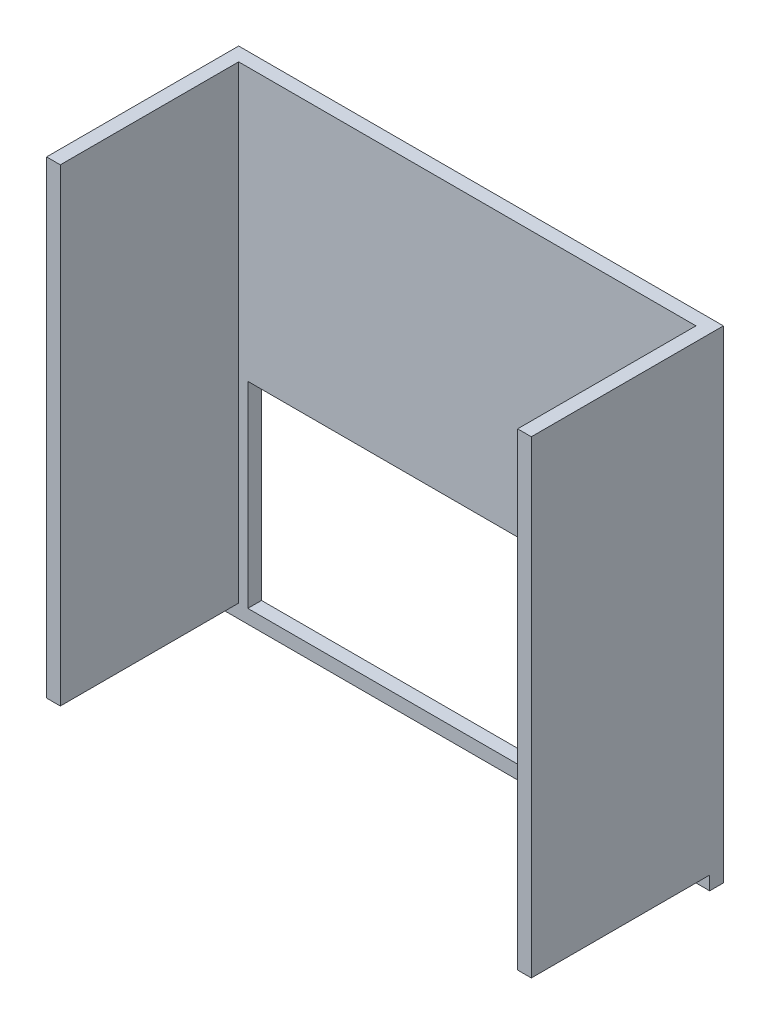
ISO-10303-21;
HEADER;
FILE_DESCRIPTION(('STEP AP214'),'2;1');
FILE_NAME('part.step','',(''),(''),'','','');
FILE_SCHEMA(('AUTOMOTIVE_DESIGN { 1 0 10303 214 1 1 1 1 }'));
ENDSEC;
DATA;
#1=APPLICATION_CONTEXT('core data for automotive mechanical design processes');
#2=APPLICATION_PROTOCOL_DEFINITION('international standard','automotive_design',2000,#1);
#3=PRODUCT_CONTEXT('',#1,'mechanical');
#4=PRODUCT('Part','Part','',(#3));
#5=PRODUCT_RELATED_PRODUCT_CATEGORY('part','',(#4));
#6=PRODUCT_DEFINITION_FORMATION('','',#4);
#7=PRODUCT_DEFINITION_CONTEXT('part definition',#1,'design');
#8=PRODUCT_DEFINITION('design','',#6,#7);
#9=PRODUCT_DEFINITION_SHAPE('','',#8);
#10=(LENGTH_UNIT() NAMED_UNIT(*) SI_UNIT(.MILLI.,.METRE.));
#11=(NAMED_UNIT(*) PLANE_ANGLE_UNIT() SI_UNIT($,.RADIAN.));
#12=(NAMED_UNIT(*) SI_UNIT($,.STERADIAN.) SOLID_ANGLE_UNIT());
#13=UNCERTAINTY_MEASURE_WITH_UNIT(LENGTH_MEASURE(1.E-05),#10,'distance_accuracy_value','');
#14=(GEOMETRIC_REPRESENTATION_CONTEXT(3) GLOBAL_UNCERTAINTY_ASSIGNED_CONTEXT((#13)) GLOBAL_UNIT_ASSIGNED_CONTEXT((#10,
#11,#12)) REPRESENTATION_CONTEXT('',''));
#15=CARTESIAN_POINT('',(0.,0.,0.));
#16=DIRECTION('',(0.,0.,1.));
#17=DIRECTION('',(1.,0.,0.));
#18=AXIS2_PLACEMENT_3D('',#15,#16,#17);
#19=CARTESIAN_POINT('',(0.,0.,0.25));
#20=DIRECTION('',(0.,0.,-1.));
#21=DIRECTION('',(-1.,0.,0.));
#22=AXIS2_PLACEMENT_3D('',#19,#20,#21);
#23=PLANE('',#22);
#24=DIRECTION('',(0.,1.,0.));
#25=VECTOR('',#24,1.);
#26=CARTESIAN_POINT('',(-53.,105.5,0.25));
#27=LINE('',#26,#25);
#28=CARTESIAN_POINT('',(-53.,3.,0.25));
#29=VERTEX_POINT('',#28);
#30=CARTESIAN_POINT('',(-53.,105.5,0.25));
#31=VERTEX_POINT('',#30);
#32=EDGE_CURVE('E217',#29,#31,#27,.T.);
#33=ORIENTED_EDGE('',*,*,#32,.F.);
#34=DIRECTION('',(1.,0.,0.));
#35=VECTOR('',#34,1.);
#36=CARTESIAN_POINT('',(0.,3.,0.25));
#37=LINE('',#36,#35);
#38=CARTESIAN_POINT('',(-50.,3.,0.25));
#39=VERTEX_POINT('',#38);
#40=EDGE_CURVE('E11',#29,#39,#37,.T.);
#41=ORIENTED_EDGE('',*,*,#40,.T.);
#42=DIRECTION('',(0.,-1.,0.));
#43=VECTOR('',#42,1.);
#44=CARTESIAN_POINT('',(-50.,0.,0.25));
#45=LINE('',#44,#43);
#46=CARTESIAN_POINT('',(-50.,105.5,0.25));
#47=VERTEX_POINT('',#46);
#48=EDGE_CURVE('E225',#47,#39,#45,.T.);
#49=ORIENTED_EDGE('',*,*,#48,.F.);
#50=DIRECTION('',(1.,0.,0.));
#51=VECTOR('',#50,1.);
#52=CARTESIAN_POINT('',(53.,105.5,0.25));
#53=LINE('',#52,#51);
#54=EDGE_CURVE('E216',#31,#47,#53,.T.);
#55=ORIENTED_EDGE('',*,*,#54,.F.);
#56=EDGE_LOOP('',(#33,#41,#49,#55));
#57=FACE_BOUND('',#56,.T.);
#58=ADVANCED_FACE('F41',(#57),#23,.F.);
#59=CARTESIAN_POINT('',(0.,3.,0.));
#60=DIRECTION('',(0.,-1.,0.));
#61=DIRECTION('',(0.,0.,-1.));
#62=AXIS2_PLACEMENT_3D('',#59,#60,#61);
#63=PLANE('',#62);
#64=DIRECTION('',(0.,0.,-1.));
#65=VECTOR('',#64,1.);
#66=CARTESIAN_POINT('',(-48.,3.,0.251000000000015));
#67=LINE('',#66,#65);
#68=CARTESIAN_POINT('',(-48.,3.,-38.75));
#69=VERTEX_POINT('',#68);
#70=CARTESIAN_POINT('',(-48.,3.,-41.75));
#71=VERTEX_POINT('',#70);
#72=EDGE_CURVE('E268',#69,#71,#67,.T.);
#73=ORIENTED_EDGE('',*,*,#72,.F.);
#74=DIRECTION('',(-1.,0.,0.));
#75=VECTOR('',#74,1.);
#76=CARTESIAN_POINT('',(-53.,3.,-38.75));
#77=LINE('',#76,#75);
#78=CARTESIAN_POINT('',(48.,3.,-38.75));
#79=VERTEX_POINT('',#78);
#80=EDGE_CURVE('E190',#79,#69,#77,.T.);
#81=ORIENTED_EDGE('',*,*,#80,.F.);
#82=DIRECTION('',(0.,0.,-1.));
#83=VECTOR('',#82,1.);
#84=CARTESIAN_POINT('',(48.,2.99999999999999,0.251000000000015));
#85=LINE('',#84,#83);
#86=CARTESIAN_POINT('',(48.,2.99999999999999,-41.75));
#87=VERTEX_POINT('',#86);
#88=EDGE_CURVE('E271',#79,#87,#85,.T.);
#89=ORIENTED_EDGE('',*,*,#88,.T.);
#90=DIRECTION('',(-1.,0.,0.));
#91=VECTOR('',#90,1.);
#92=CARTESIAN_POINT('',(-48.,3.,-41.75));
#93=LINE('',#92,#91);
#94=EDGE_CURVE('E264',#87,#71,#93,.T.);
#95=ORIENTED_EDGE('',*,*,#94,.T.);
#96=EDGE_LOOP('',(#73,#81,#89,#95));
#97=FACE_BOUND('',#96,.T.);
#98=ADVANCED_FACE('F293',(#97),#63,.F.);
#99=CARTESIAN_POINT('',(-50.,0.,38.75));
#100=DIRECTION('',(-1.,0.,0.));
#101=DIRECTION('',(0.,0.,1.));
#102=AXIS2_PLACEMENT_3D('',#99,#100,#101);
#103=PLANE('',#102);
#104=DIRECTION('',(0.,0.,1.));
#105=VECTOR('',#104,1.);
#106=CARTESIAN_POINT('',(-50.,105.5,38.75));
#107=LINE('',#106,#105);
#108=CARTESIAN_POINT('',(-50.,105.5,-38.75));
#109=VERTEX_POINT('',#108);
#110=EDGE_CURVE('E228',#109,#47,#107,.T.);
#111=ORIENTED_EDGE('',*,*,#110,.T.);
#112=ORIENTED_EDGE('',*,*,#48,.T.);
#113=DIRECTION('',(0.,0.,-1.));
#114=VECTOR('',#113,1.);
#115=CARTESIAN_POINT('',(-50.,3.,38.75));
#116=LINE('',#115,#114);
#117=CARTESIAN_POINT('',(-50.,3.,-38.75));
#118=VERTEX_POINT('',#117);
#119=EDGE_CURVE('E175',#39,#118,#116,.T.);
#120=ORIENTED_EDGE('',*,*,#119,.T.);
#121=DIRECTION('',(0.,1.,0.));
#122=VECTOR('',#121,1.);
#123=CARTESIAN_POINT('',(-50.,0.,-38.75));
#124=LINE('',#123,#122);
#125=EDGE_CURVE('E196',#118,#109,#124,.T.);
#126=ORIENTED_EDGE('',*,*,#125,.T.);
#127=EDGE_LOOP('',(#111,#112,#120,#126));
#128=FACE_BOUND('',#127,.T.);
#129=ADVANCED_FACE('F244',(#128),#103,.F.);
#130=CARTESIAN_POINT('',(-50.,0.,-38.75));
#131=DIRECTION('',(0.,0.,-1.));
#132=DIRECTION('',(-1.,0.,0.));
#133=AXIS2_PLACEMENT_3D('',#130,#131,#132);
#134=PLANE('',#133);
#135=ORIENTED_EDGE('',*,*,#80,.T.);
#136=DIRECTION('',(0.,-1.,0.));
#137=VECTOR('',#136,1.);
#138=CARTESIAN_POINT('',(-48.,3.,-38.75));
#139=LINE('',#138,#137);
#140=CARTESIAN_POINT('',(-48.,46.,-38.75));
#141=VERTEX_POINT('',#140);
#142=EDGE_CURVE('E249',#141,#69,#139,.T.);
#143=ORIENTED_EDGE('',*,*,#142,.F.);
#144=DIRECTION('',(-1.,0.,0.));
#145=VECTOR('',#144,1.);
#146=CARTESIAN_POINT('',(-48.,46.,-38.75));
#147=LINE('',#146,#145);
#148=CARTESIAN_POINT('',(48.,46.,-38.75));
#149=VERTEX_POINT('',#148);
#150=EDGE_CURVE('E270',#149,#141,#147,.T.);
#151=ORIENTED_EDGE('',*,*,#150,.F.);
#152=DIRECTION('',(0.,1.,0.));
#153=VECTOR('',#152,1.);
#154=CARTESIAN_POINT('',(48.,2.99999999999999,-38.75));
#155=LINE('',#154,#153);
#156=EDGE_CURVE('E64',#79,#149,#155,.T.);
#157=ORIENTED_EDGE('',*,*,#156,.F.);
#158=EDGE_LOOP('',(#135,#143,#151,#157));
#159=FACE_BOUND('',#158,.T.);
#160=ORIENTED_EDGE('',*,*,#125,.F.);
#161=CARTESIAN_POINT('',(-53.,3.,-38.75));
#162=VERTEX_POINT('',#161);
#163=EDGE_CURVE('E192',#118,#162,#77,.T.);
#164=ORIENTED_EDGE('',*,*,#163,.T.);
#165=DIRECTION('',(0.,-1.,0.));
#166=VECTOR('',#165,1.);
#167=CARTESIAN_POINT('',(-53.,3.,-38.75));
#168=LINE('',#167,#166);
#169=CARTESIAN_POINT('',(-53.,0.,-38.75));
#170=VERTEX_POINT('',#169);
#171=EDGE_CURVE('E150',#162,#170,#168,.T.);
#172=ORIENTED_EDGE('',*,*,#171,.T.);
#173=DIRECTION('',(1.,0.,0.));
#174=VECTOR('',#173,1.);
#175=CARTESIAN_POINT('',(-53.,0.,-38.75));
#176=LINE('',#175,#174);
#177=CARTESIAN_POINT('',(53.,0.,-38.75));
#178=VERTEX_POINT('',#177);
#179=EDGE_CURVE('E143',#170,#178,#176,.T.);
#180=ORIENTED_EDGE('',*,*,#179,.T.);
#181=DIRECTION('',(0.,1.,0.));
#182=VECTOR('',#181,1.);
#183=CARTESIAN_POINT('',(53.,3.,-38.75));
#184=LINE('',#183,#182);
#185=CARTESIAN_POINT('',(53.,3.,-38.75));
#186=VERTEX_POINT('',#185);
#187=EDGE_CURVE('E148',#178,#186,#184,.T.);
#188=ORIENTED_EDGE('',*,*,#187,.T.);
#189=CARTESIAN_POINT('',(50.,3.,-38.75));
#190=VERTEX_POINT('',#189);
#191=EDGE_CURVE('E180',#186,#190,#77,.T.);
#192=ORIENTED_EDGE('',*,*,#191,.T.);
#193=DIRECTION('',(0.,1.,0.));
#194=VECTOR('',#193,1.);
#195=CARTESIAN_POINT('',(50.,0.,-38.75));
#196=LINE('',#195,#194);
#197=CARTESIAN_POINT('',(50.,105.5,-38.75));
#198=VERTEX_POINT('',#197);
#199=EDGE_CURVE('E187',#190,#198,#196,.T.);
#200=ORIENTED_EDGE('',*,*,#199,.T.);
#201=DIRECTION('',(-1.,0.,0.));
#202=VECTOR('',#201,1.);
#203=CARTESIAN_POINT('',(-50.,105.5,-38.75));
#204=LINE('',#203,#202);
#205=EDGE_CURVE('E232',#198,#109,#204,.T.);
#206=ORIENTED_EDGE('',*,*,#205,.T.);
#207=EDGE_LOOP('',(#160,#164,#172,#180,#188,#192,#200,#206));
#208=FACE_BOUND('',#207,.T.);
#209=ADVANCED_FACE('F146',(#159,#208),#134,.F.);
#210=CARTESIAN_POINT('',(50.,0.,38.75));
#211=DIRECTION('',(1.,0.,0.));
#212=DIRECTION('',(0.,0.,-1.));
#213=AXIS2_PLACEMENT_3D('',#210,#211,#212);
#214=PLANE('',#213);
#215=DIRECTION('',(0.,0.,-1.));
#216=VECTOR('',#215,1.);
#217=CARTESIAN_POINT('',(50.,3.,38.75));
#218=LINE('',#217,#216);
#219=CARTESIAN_POINT('',(50.,3.,0.25));
#220=VERTEX_POINT('',#219);
#221=EDGE_CURVE('E49',#220,#190,#218,.T.);
#222=ORIENTED_EDGE('',*,*,#221,.F.);
#223=DIRECTION('',(0.,1.,0.));
#224=VECTOR('',#223,1.);
#225=CARTESIAN_POINT('',(50.,0.,0.25));
#226=LINE('',#225,#224);
#227=CARTESIAN_POINT('',(50.,105.5,0.25));
#228=VERTEX_POINT('',#227);
#229=EDGE_CURVE('E220',#220,#228,#226,.T.);
#230=ORIENTED_EDGE('',*,*,#229,.T.);
#231=DIRECTION('',(0.,0.,-1.));
#232=VECTOR('',#231,1.);
#233=CARTESIAN_POINT('',(50.,105.5,38.75));
#234=LINE('',#233,#232);
#235=EDGE_CURVE('E195',#228,#198,#234,.T.);
#236=ORIENTED_EDGE('',*,*,#235,.T.);
#237=ORIENTED_EDGE('',*,*,#199,.F.);
#238=EDGE_LOOP('',(#222,#230,#236,#237));
#239=FACE_BOUND('',#238,.T.);
#240=ADVANCED_FACE('F193',(#239),#214,.F.);
#241=CARTESIAN_POINT('',(53.,0.,-41.75));
#242=DIRECTION('',(0.,0.,-1.));
#243=DIRECTION('',(-1.,0.,0.));
#244=AXIS2_PLACEMENT_3D('',#241,#242,#243);
#245=PLANE('',#244);
#246=DIRECTION('',(0.,1.,0.));
#247=VECTOR('',#246,1.);
#248=CARTESIAN_POINT('',(-48.,3.,-41.75));
#249=LINE('',#248,#247);
#250=CARTESIAN_POINT('',(-48.,46.,-41.75));
#251=VERTEX_POINT('',#250);
#252=EDGE_CURVE('E256',#71,#251,#249,.T.);
#253=ORIENTED_EDGE('',*,*,#252,.F.);
#254=ORIENTED_EDGE('',*,*,#94,.F.);
#255=DIRECTION('',(0.,-1.,0.));
#256=VECTOR('',#255,1.);
#257=CARTESIAN_POINT('',(48.,2.99999999999999,-41.75));
#258=LINE('',#257,#256);
#259=CARTESIAN_POINT('',(48.,46.,-41.75));
#260=VERTEX_POINT('',#259);
#261=EDGE_CURVE('E261',#260,#87,#258,.T.);
#262=ORIENTED_EDGE('',*,*,#261,.F.);
#263=DIRECTION('',(1.,0.,0.));
#264=VECTOR('',#263,1.);
#265=CARTESIAN_POINT('',(-48.,46.,-41.75));
#266=LINE('',#265,#264);
#267=EDGE_CURVE('E258',#251,#260,#266,.T.);
#268=ORIENTED_EDGE('',*,*,#267,.F.);
#269=EDGE_LOOP('',(#253,#254,#262,#268));
#270=FACE_BOUND('',#269,.T.);
#271=DIRECTION('',(0.,1.,0.));
#272=VECTOR('',#271,1.);
#273=CARTESIAN_POINT('',(-53.,0.,-41.75));
#274=LINE('',#273,#272);
#275=CARTESIAN_POINT('',(-53.,0.,-41.75));
#276=VERTEX_POINT('',#275);
#277=CARTESIAN_POINT('',(-53.,105.5,-41.75));
#278=VERTEX_POINT('',#277);
#279=EDGE_CURVE('E167',#276,#278,#274,.T.);
#280=ORIENTED_EDGE('',*,*,#279,.T.);
#281=DIRECTION('',(-1.,0.,0.));
#282=VECTOR('',#281,1.);
#283=CARTESIAN_POINT('',(53.,105.5,-41.75));
#284=LINE('',#283,#282);
#285=CARTESIAN_POINT('',(53.,105.5,-41.75));
#286=VERTEX_POINT('',#285);
#287=EDGE_CURVE('E207',#286,#278,#284,.T.);
#288=ORIENTED_EDGE('',*,*,#287,.F.);
#289=DIRECTION('',(0.,1.,0.));
#290=VECTOR('',#289,1.);
#291=CARTESIAN_POINT('',(53.,0.,-41.75));
#292=LINE('',#291,#290);
#293=CARTESIAN_POINT('',(53.,0.,-41.75));
#294=VERTEX_POINT('',#293);
#295=EDGE_CURVE('E170',#294,#286,#292,.T.);
#296=ORIENTED_EDGE('',*,*,#295,.F.);
#297=DIRECTION('',(-1.,0.,0.));
#298=VECTOR('',#297,1.);
#299=CARTESIAN_POINT('',(53.,0.,-41.75));
#300=LINE('',#299,#298);
#301=EDGE_CURVE('E166',#294,#276,#300,.T.);
#302=ORIENTED_EDGE('',*,*,#301,.T.);
#303=EDGE_LOOP('',(#280,#288,#296,#302));
#304=FACE_BOUND('',#303,.T.);
#305=ADVANCED_FACE('F203',(#270,#304),#245,.T.);
#306=CARTESIAN_POINT('',(53.,0.,41.75));
#307=DIRECTION('',(1.,0.,0.));
#308=DIRECTION('',(0.,0.,-1.));
#309=AXIS2_PLACEMENT_3D('',#306,#307,#308);
#310=PLANE('',#309);
#311=ORIENTED_EDGE('',*,*,#187,.F.);
#312=DIRECTION('',(0.,0.,-1.));
#313=VECTOR('',#312,1.);
#314=CARTESIAN_POINT('',(53.,0.,41.75));
#315=LINE('',#314,#313);
#316=EDGE_CURVE('E160',#178,#294,#315,.T.);
#317=ORIENTED_EDGE('',*,*,#316,.T.);
#318=ORIENTED_EDGE('',*,*,#295,.T.);
#319=DIRECTION('',(0.,0.,-1.));
#320=VECTOR('',#319,1.);
#321=CARTESIAN_POINT('',(53.,105.5,41.75));
#322=LINE('',#321,#320);
#323=CARTESIAN_POINT('',(53.,105.5,0.25));
#324=VERTEX_POINT('',#323);
#325=EDGE_CURVE('E197',#324,#286,#322,.T.);
#326=ORIENTED_EDGE('',*,*,#325,.F.);
#327=DIRECTION('',(0.,-1.,0.));
#328=VECTOR('',#327,1.);
#329=CARTESIAN_POINT('',(53.,105.5,0.25));
#330=LINE('',#329,#328);
#331=CARTESIAN_POINT('',(53.,3.,0.25));
#332=VERTEX_POINT('',#331);
#333=EDGE_CURVE('E209',#324,#332,#330,.T.);
#334=ORIENTED_EDGE('',*,*,#333,.T.);
#335=DIRECTION('',(0.,0.,1.));
#336=VECTOR('',#335,1.);
#337=CARTESIAN_POINT('',(53.,3.,-144.792444332446));
#338=LINE('',#337,#336);
#339=EDGE_CURVE('E56',#186,#332,#338,.T.);
#340=ORIENTED_EDGE('',*,*,#339,.F.);
#341=EDGE_LOOP('',(#311,#317,#318,#326,#334,#340));
#342=FACE_BOUND('',#341,.T.);
#343=ADVANCED_FACE('F158',(#342),#310,.T.);
#344=CARTESIAN_POINT('',(-53.,0.,-41.75));
#345=DIRECTION('',(-1.,0.,0.));
#346=DIRECTION('',(0.,0.,1.));
#347=AXIS2_PLACEMENT_3D('',#344,#345,#346);
#348=PLANE('',#347);
#349=ORIENTED_EDGE('',*,*,#171,.F.);
#350=DIRECTION('',(0.,0.,1.));
#351=VECTOR('',#350,1.);
#352=CARTESIAN_POINT('',(-53.,3.,-144.792444332446));
#353=LINE('',#352,#351);
#354=EDGE_CURVE('E189',#162,#29,#353,.T.);
#355=ORIENTED_EDGE('',*,*,#354,.T.);
#356=ORIENTED_EDGE('',*,*,#32,.T.);
#357=DIRECTION('',(0.,0.,1.));
#358=VECTOR('',#357,1.);
#359=CARTESIAN_POINT('',(-53.,105.5,-41.75));
#360=LINE('',#359,#358);
#361=EDGE_CURVE('E200',#278,#31,#360,.T.);
#362=ORIENTED_EDGE('',*,*,#361,.F.);
#363=ORIENTED_EDGE('',*,*,#279,.F.);
#364=DIRECTION('',(0.,0.,1.));
#365=VECTOR('',#364,1.);
#366=CARTESIAN_POINT('',(-53.,0.,-41.75));
#367=LINE('',#366,#365);
#368=EDGE_CURVE('E168',#276,#170,#367,.T.);
#369=ORIENTED_EDGE('',*,*,#368,.T.);
#370=EDGE_LOOP('',(#349,#355,#356,#362,#363,#369));
#371=FACE_BOUND('',#370,.T.);
#372=ADVANCED_FACE('F238',(#371),#348,.T.);
#373=CARTESIAN_POINT('',(0.,105.5,0.));
#374=DIRECTION('',(0.,1.,0.));
#375=DIRECTION('',(0.,0.,1.));
#376=AXIS2_PLACEMENT_3D('',#373,#374,#375);
#377=PLANE('',#376);
#378=EDGE_CURVE('E214',#228,#324,#53,.T.);
#379=ORIENTED_EDGE('',*,*,#378,.T.);
#380=ORIENTED_EDGE('',*,*,#325,.T.);
#381=ORIENTED_EDGE('',*,*,#287,.T.);
#382=ORIENTED_EDGE('',*,*,#361,.T.);
#383=ORIENTED_EDGE('',*,*,#54,.T.);
#384=ORIENTED_EDGE('',*,*,#110,.F.);
#385=ORIENTED_EDGE('',*,*,#205,.F.);
#386=ORIENTED_EDGE('',*,*,#235,.F.);
#387=EDGE_LOOP('',(#379,#380,#381,#382,#383,#384,#385,#386));
#388=FACE_BOUND('',#387,.T.);
#389=ADVANCED_FACE('F212',(#388),#377,.T.);
#390=CARTESIAN_POINT('',(0.,0.,0.));
#391=DIRECTION('',(0.,-1.,0.));
#392=DIRECTION('',(0.,0.,-1.));
#393=AXIS2_PLACEMENT_3D('',#390,#391,#392);
#394=PLANE('',#393);
#395=ORIENTED_EDGE('',*,*,#179,.F.);
#396=ORIENTED_EDGE('',*,*,#368,.F.);
#397=ORIENTED_EDGE('',*,*,#301,.F.);
#398=ORIENTED_EDGE('',*,*,#316,.F.);
#399=EDGE_LOOP('',(#395,#396,#397,#398));
#400=FACE_BOUND('',#399,.T.);
#401=ADVANCED_FACE('F43',(#400),#394,.T.);
#402=ORIENTED_EDGE('',*,*,#229,.F.);
#403=DIRECTION('',(-1.,0.,0.));
#404=VECTOR('',#403,1.);
#405=CARTESIAN_POINT('',(-53.,3.,0.25));
#406=LINE('',#405,#404);
#407=EDGE_CURVE('E155',#332,#220,#406,.T.);
#408=ORIENTED_EDGE('',*,*,#407,.F.);
#409=ORIENTED_EDGE('',*,*,#333,.F.);
#410=ORIENTED_EDGE('',*,*,#378,.F.);
#411=EDGE_LOOP('',(#402,#408,#409,#410));
#412=FACE_BOUND('',#411,.T.);
#413=ADVANCED_FACE('F301',(#412),#23,.F.);
#414=CARTESIAN_POINT('',(-48.,3.,0.251000000000015));
#415=DIRECTION('',(-1.,0.,0.));
#416=DIRECTION('',(0.,0.,1.));
#417=AXIS2_PLACEMENT_3D('',#414,#415,#416);
#418=PLANE('',#417);
#419=ORIENTED_EDGE('',*,*,#142,.T.);
#420=ORIENTED_EDGE('',*,*,#72,.T.);
#421=ORIENTED_EDGE('',*,*,#252,.T.);
#422=DIRECTION('',(0.,0.,-1.));
#423=VECTOR('',#422,1.);
#424=CARTESIAN_POINT('',(-48.,46.,0.251000000000015));
#425=LINE('',#424,#423);
#426=EDGE_CURVE('E267',#141,#251,#425,.T.);
#427=ORIENTED_EDGE('',*,*,#426,.F.);
#428=EDGE_LOOP('',(#419,#420,#421,#427));
#429=FACE_BOUND('',#428,.T.);
#430=ADVANCED_FACE('F286',(#429),#418,.F.);
#431=CARTESIAN_POINT('',(48.,2.99999999999999,0.251000000000015));
#432=DIRECTION('',(1.,0.,0.));
#433=DIRECTION('',(0.,0.,-1.));
#434=AXIS2_PLACEMENT_3D('',#431,#432,#433);
#435=PLANE('',#434);
#436=ORIENTED_EDGE('',*,*,#156,.T.);
#437=DIRECTION('',(0.,0.,-1.));
#438=VECTOR('',#437,1.);
#439=CARTESIAN_POINT('',(48.,46.,0.251000000000015));
#440=LINE('',#439,#438);
#441=EDGE_CURVE('E273',#149,#260,#440,.T.);
#442=ORIENTED_EDGE('',*,*,#441,.T.);
#443=ORIENTED_EDGE('',*,*,#261,.T.);
#444=ORIENTED_EDGE('',*,*,#88,.F.);
#445=EDGE_LOOP('',(#436,#442,#443,#444));
#446=FACE_BOUND('',#445,.T.);
#447=ADVANCED_FACE('F291',(#446),#435,.F.);
#448=CARTESIAN_POINT('',(-48.,46.,0.251000000000015));
#449=DIRECTION('',(0.,1.,0.));
#450=DIRECTION('',(-1.,0.,0.));
#451=AXIS2_PLACEMENT_3D('',#448,#449,#450);
#452=PLANE('',#451);
#453=ORIENTED_EDGE('',*,*,#150,.T.);
#454=ORIENTED_EDGE('',*,*,#426,.T.);
#455=ORIENTED_EDGE('',*,*,#267,.T.);
#456=ORIENTED_EDGE('',*,*,#441,.F.);
#457=EDGE_LOOP('',(#453,#454,#455,#456));
#458=FACE_BOUND('',#457,.T.);
#459=ADVANCED_FACE('F281',(#458),#452,.F.);
#460=CARTESIAN_POINT('',(-53.,3.,-144.792444332446));
#461=DIRECTION('',(0.,1.,0.));
#462=DIRECTION('',(0.,0.,1.));
#463=AXIS2_PLACEMENT_3D('',#460,#461,#462);
#464=PLANE('',#463);
#465=ORIENTED_EDGE('',*,*,#40,.F.);
#466=ORIENTED_EDGE('',*,*,#354,.F.);
#467=ORIENTED_EDGE('',*,*,#163,.F.);
#468=ORIENTED_EDGE('',*,*,#119,.F.);
#469=EDGE_LOOP('',(#465,#466,#467,#468));
#470=FACE_BOUND('',#469,.T.);
#471=ADVANCED_FACE('F246',(#470),#464,.F.);
#472=ORIENTED_EDGE('',*,*,#191,.F.);
#473=ORIENTED_EDGE('',*,*,#339,.T.);
#474=ORIENTED_EDGE('',*,*,#407,.T.);
#475=ORIENTED_EDGE('',*,*,#221,.T.);
#476=EDGE_LOOP('',(#472,#473,#474,#475));
#477=FACE_BOUND('',#476,.T.);
#478=ADVANCED_FACE('F179',(#477),#464,.F.);
#479=CLOSED_SHELL('',(#58,#98,#129,#209,#240,#305,#343,#372,#389,#401,#413,#430,#447,#459,#471,#478));
#480=MANIFOLD_SOLID_BREP('B2',#479);
#481=ADVANCED_BREP_SHAPE_REPRESENTATION('',(#18,#480),#14);
#482=SHAPE_DEFINITION_REPRESENTATION(#9,#481);
ENDSEC;
END-ISO-10303-21;
